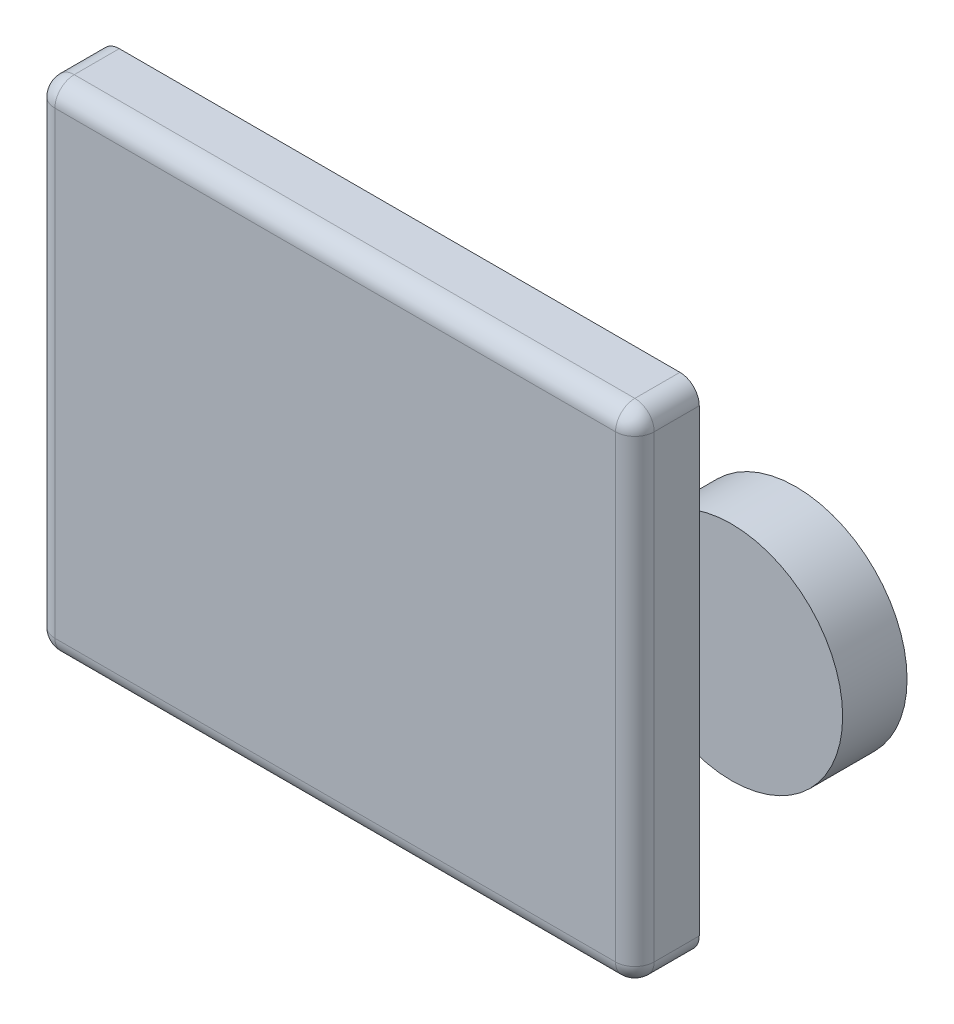
ISO-10303-21;
HEADER;
FILE_DESCRIPTION(('STEP AP214'),'2;1');
FILE_NAME('part.step','',(''),(''),'','','');
FILE_SCHEMA(('AUTOMOTIVE_DESIGN { 1 0 10303 214 1 1 1 1 }'));
ENDSEC;
DATA;
#1=APPLICATION_CONTEXT('core data for automotive mechanical design processes');
#2=APPLICATION_PROTOCOL_DEFINITION('international standard','automotive_design',2000,#1);
#3=PRODUCT_CONTEXT('',#1,'mechanical');
#4=PRODUCT('Part','Part','',(#3));
#5=PRODUCT_RELATED_PRODUCT_CATEGORY('part','',(#4));
#6=PRODUCT_DEFINITION_FORMATION('','',#4);
#7=PRODUCT_DEFINITION_CONTEXT('part definition',#1,'design');
#8=PRODUCT_DEFINITION('design','',#6,#7);
#9=PRODUCT_DEFINITION_SHAPE('','',#8);
#10=(LENGTH_UNIT() NAMED_UNIT(*) SI_UNIT(.MILLI.,.METRE.));
#11=(NAMED_UNIT(*) PLANE_ANGLE_UNIT() SI_UNIT($,.RADIAN.));
#12=(NAMED_UNIT(*) SI_UNIT($,.STERADIAN.) SOLID_ANGLE_UNIT());
#13=UNCERTAINTY_MEASURE_WITH_UNIT(LENGTH_MEASURE(1.E-05),#10,'distance_accuracy_value','');
#14=(GEOMETRIC_REPRESENTATION_CONTEXT(3) GLOBAL_UNCERTAINTY_ASSIGNED_CONTEXT((#13)) GLOBAL_UNIT_ASSIGNED_CONTEXT((#10,
#11,#12)) REPRESENTATION_CONTEXT('',''));
#15=CARTESIAN_POINT('',(0.,0.,0.));
#16=DIRECTION('',(0.,0.,1.));
#17=DIRECTION('',(1.,0.,0.));
#18=AXIS2_PLACEMENT_3D('',#15,#16,#17);
#19=CARTESIAN_POINT('',(44.0481916480239,-0.618220233656479,-15.));
#20=DIRECTION('',(0.,0.,1.));
#21=DIRECTION('',(1.,0.,0.));
#22=AXIS2_PLACEMENT_3D('',#19,#20,#21);
#23=CYLINDRICAL_SURFACE('',#22,17.2617733123611);
#24=CARTESIAN_POINT('',(44.0481916480239,-0.618220233656479,-15.));
#25=DIRECTION('',(0.,0.,1.));
#26=DIRECTION('',(1.,0.,0.));
#27=AXIS2_PLACEMENT_3D('',#24,#25,#26);
#28=CIRCLE('',#27,17.2617733123611);
#29=CARTESIAN_POINT('',(61.309964960385,-0.618220233656479,-15.));
#30=VERTEX_POINT('',#29);
#31=EDGE_CURVE('E11',#30,#30,#28,.T.);
#32=ORIENTED_EDGE('',*,*,#31,.T.);
#33=EDGE_LOOP('',(#32));
#34=FACE_BOUND('',#33,.T.);
#35=CARTESIAN_POINT('',(44.0481916480239,-0.618220233656479,-5.));
#36=DIRECTION('',(0.,0.,1.));
#37=DIRECTION('',(1.,0.,0.));
#38=AXIS2_PLACEMENT_3D('',#35,#36,#37);
#39=CIRCLE('',#38,17.2617733123611);
#40=CARTESIAN_POINT('',(61.309964960385,-0.618220233656479,-5.));
#41=VERTEX_POINT('',#40);
#42=EDGE_CURVE('E50',#41,#41,#39,.T.);
#43=ORIENTED_EDGE('',*,*,#42,.F.);
#44=EDGE_LOOP('',(#43));
#45=FACE_BOUND('',#44,.T.);
#46=ADVANCED_FACE('F47',(#34,#45),#23,.T.);
#47=CARTESIAN_POINT('',(44.0481916480239,-0.618220233656479,-15.));
#48=DIRECTION('',(0.,0.,1.));
#49=DIRECTION('',(1.,0.,0.));
#50=AXIS2_PLACEMENT_3D('',#47,#48,#49);
#51=PLANE('',#50);
#52=ORIENTED_EDGE('',*,*,#31,.F.);
#53=EDGE_LOOP('',(#52));
#54=FACE_BOUND('',#53,.T.);
#55=ADVANCED_FACE('F62',(#54),#51,.F.);
#56=CARTESIAN_POINT('',(44.0481916480239,-0.618220233656479,-5.));
#57=DIRECTION('',(0.,0.,1.));
#58=DIRECTION('',(1.,0.,0.));
#59=AXIS2_PLACEMENT_3D('',#56,#57,#58);
#60=PLANE('',#59);
#61=ORIENTED_EDGE('',*,*,#42,.T.);
#62=EDGE_LOOP('',(#61));
#63=FACE_BOUND('',#62,.T.);
#64=ADVANCED_FACE('F59',(#63),#60,.T.);
#65=CLOSED_SHELL('',(#46,#55,#64));
#66=MANIFOLD_SOLID_BREP('B2',#65);
#67=CARTESIAN_POINT('',(-48.9939535172757,38.0205443698732,10.));
#68=DIRECTION('',(1.,0.,0.));
#69=DIRECTION('',(0.,0.,-1.));
#70=AXIS2_PLACEMENT_3D('',#67,#68,#69);
#71=PLANE('',#70);
#72=DIRECTION('',(0.,-1.,0.));
#73=VECTOR('',#72,1.);
#74=CARTESIAN_POINT('',(-48.9939535172757,38.0205443698732,0.));
#75=LINE('',#74,#73);
#76=CARTESIAN_POINT('',(-48.9939535172757,35.0205443698732,0.));
#77=VERTEX_POINT('',#76);
#78=CARTESIAN_POINT('',(-48.9939535172757,-36.2569848371862,0.));
#79=VERTEX_POINT('',#78);
#80=EDGE_CURVE('E217',#77,#79,#75,.T.);
#81=ORIENTED_EDGE('',*,*,#80,.T.);
#82=DIRECTION('',(0.,0.,-1.));
#83=VECTOR('',#82,1.);
#84=CARTESIAN_POINT('',(-48.9939535172757,-36.2569848371862,10.));
#85=LINE('',#84,#83);
#86=CARTESIAN_POINT('',(-48.9939535172757,-36.2569848371862,7.));
#87=VERTEX_POINT('',#86);
#88=EDGE_CURVE('E241',#79,#87,#85,.F.);
#89=ORIENTED_EDGE('',*,*,#88,.T.);
#90=DIRECTION('',(0.,-1.,0.));
#91=VECTOR('',#90,1.);
#92=CARTESIAN_POINT('',(-48.9939535172757,38.0205443698732,7.));
#93=LINE('',#92,#91);
#94=CARTESIAN_POINT('',(-48.9939535172757,35.0205443698732,7.));
#95=VERTEX_POINT('',#94);
#96=EDGE_CURVE('E265',#87,#95,#93,.F.);
#97=ORIENTED_EDGE('',*,*,#96,.T.);
#98=DIRECTION('',(0.,0.,-1.));
#99=VECTOR('',#98,1.);
#100=CARTESIAN_POINT('',(-48.9939535172757,35.0205443698732,10.));
#101=LINE('',#100,#99);
#102=EDGE_CURVE('E239',#95,#77,#101,.T.);
#103=ORIENTED_EDGE('',*,*,#102,.T.);
#104=EDGE_LOOP('',(#81,#89,#97,#103));
#105=FACE_BOUND('',#104,.T.);
#106=ADVANCED_FACE('F88',(#105),#71,.F.);
#107=CARTESIAN_POINT('',(-48.9939535172757,-39.2569848371862,10.));
#108=DIRECTION('',(0.,1.,0.));
#109=DIRECTION('',(0.,0.,1.));
#110=AXIS2_PLACEMENT_3D('',#107,#108,#109);
#111=PLANE('',#110);
#112=DIRECTION('',(1.,0.,0.));
#113=VECTOR('',#112,1.);
#114=CARTESIAN_POINT('',(-48.9939535172757,-39.2569848371862,7.));
#115=LINE('',#114,#113);
#116=CARTESIAN_POINT('',(41.0481916480239,-39.2569848371862,7.));
#117=VERTEX_POINT('',#116);
#118=CARTESIAN_POINT('',(-45.9939535172757,-39.2569848371862,7.));
#119=VERTEX_POINT('',#118);
#120=EDGE_CURVE('E174',#117,#119,#115,.F.);
#121=ORIENTED_EDGE('',*,*,#120,.T.);
#122=DIRECTION('',(0.,0.,-1.));
#123=VECTOR('',#122,1.);
#124=CARTESIAN_POINT('',(-45.9939535172757,-39.2569848371862,10.));
#125=LINE('',#124,#123);
#126=CARTESIAN_POINT('',(-45.9939535172757,-39.2569848371862,0.));
#127=VERTEX_POINT('',#126);
#128=EDGE_CURVE('E232',#119,#127,#125,.T.);
#129=ORIENTED_EDGE('',*,*,#128,.T.);
#130=DIRECTION('',(1.,0.,0.));
#131=VECTOR('',#130,1.);
#132=CARTESIAN_POINT('',(-48.9939535172757,-39.2569848371862,0.));
#133=LINE('',#132,#131);
#134=CARTESIAN_POINT('',(41.0481916480239,-39.2569848371862,0.));
#135=VERTEX_POINT('',#134);
#136=EDGE_CURVE('E452',#127,#135,#133,.T.);
#137=ORIENTED_EDGE('',*,*,#136,.T.);
#138=DIRECTION('',(0.,0.,-1.));
#139=VECTOR('',#138,1.);
#140=CARTESIAN_POINT('',(41.0481916480239,-39.2569848371862,10.));
#141=LINE('',#140,#139);
#142=EDGE_CURVE('E213',#135,#117,#141,.F.);
#143=ORIENTED_EDGE('',*,*,#142,.T.);
#144=EDGE_LOOP('',(#121,#129,#137,#143));
#145=FACE_BOUND('',#144,.T.);
#146=ADVANCED_FACE('F273',(#145),#111,.F.);
#147=CARTESIAN_POINT('',(44.0481916480239,38.0205443698732,10.));
#148=DIRECTION('',(-1.,0.,0.));
#149=DIRECTION('',(0.,0.,1.));
#150=AXIS2_PLACEMENT_3D('',#147,#148,#149);
#151=PLANE('',#150);
#152=DIRECTION('',(0.,1.,0.));
#153=VECTOR('',#152,1.);
#154=CARTESIAN_POINT('',(44.0481916480239,38.0205443698732,0.));
#155=LINE('',#154,#153);
#156=CARTESIAN_POINT('',(44.0481916480239,-36.2569848371862,0.));
#157=VERTEX_POINT('',#156);
#158=CARTESIAN_POINT('',(44.0481916480239,35.0205443698732,0.));
#159=VERTEX_POINT('',#158);
#160=EDGE_CURVE('E450',#157,#159,#155,.T.);
#161=ORIENTED_EDGE('',*,*,#160,.T.);
#162=DIRECTION('',(0.,0.,-1.));
#163=VECTOR('',#162,1.);
#164=CARTESIAN_POINT('',(44.0481916480239,35.0205443698732,10.));
#165=LINE('',#164,#163);
#166=CARTESIAN_POINT('',(44.0481916480239,35.0205443698732,7.));
#167=VERTEX_POINT('',#166);
#168=EDGE_CURVE('E45',#159,#167,#165,.F.);
#169=ORIENTED_EDGE('',*,*,#168,.T.);
#170=DIRECTION('',(0.,1.,0.));
#171=VECTOR('',#170,1.);
#172=CARTESIAN_POINT('',(44.0481916480239,-39.2569848371862,7.));
#173=LINE('',#172,#171);
#174=CARTESIAN_POINT('',(44.0481916480239,-36.2569848371862,7.));
#175=VERTEX_POINT('',#174);
#176=EDGE_CURVE('E204',#167,#175,#173,.F.);
#177=ORIENTED_EDGE('',*,*,#176,.T.);
#178=DIRECTION('',(0.,0.,-1.));
#179=VECTOR('',#178,1.);
#180=CARTESIAN_POINT('',(44.0481916480239,-36.2569848371862,10.));
#181=LINE('',#180,#179);
#182=EDGE_CURVE('E179',#175,#157,#181,.T.);
#183=ORIENTED_EDGE('',*,*,#182,.T.);
#184=EDGE_LOOP('',(#161,#169,#177,#183));
#185=FACE_BOUND('',#184,.T.);
#186=ADVANCED_FACE('F306',(#185),#151,.F.);
#187=CARTESIAN_POINT('',(-48.9939535172757,38.0205443698732,10.));
#188=DIRECTION('',(0.,-1.,0.));
#189=DIRECTION('',(0.,0.,-1.));
#190=AXIS2_PLACEMENT_3D('',#187,#188,#189);
#191=PLANE('',#190);
#192=DIRECTION('',(-1.,0.,0.));
#193=VECTOR('',#192,1.);
#194=CARTESIAN_POINT('',(-48.9939535172757,38.0205443698732,0.));
#195=LINE('',#194,#193);
#196=CARTESIAN_POINT('',(41.0481916480239,38.0205443698732,0.));
#197=VERTEX_POINT('',#196);
#198=CARTESIAN_POINT('',(-45.9939535172757,38.0205443698732,0.));
#199=VERTEX_POINT('',#198);
#200=EDGE_CURVE('E199',#197,#199,#195,.T.);
#201=ORIENTED_EDGE('',*,*,#200,.T.);
#202=DIRECTION('',(0.,0.,-1.));
#203=VECTOR('',#202,1.);
#204=CARTESIAN_POINT('',(-45.9939535172757,38.0205443698732,10.));
#205=LINE('',#204,#203);
#206=CARTESIAN_POINT('',(-45.9939535172757,38.0205443698732,7.));
#207=VERTEX_POINT('',#206);
#208=EDGE_CURVE('E97',#199,#207,#205,.F.);
#209=ORIENTED_EDGE('',*,*,#208,.T.);
#210=DIRECTION('',(-1.,0.,0.));
#211=VECTOR('',#210,1.);
#212=CARTESIAN_POINT('',(44.0481916480239,38.0205443698732,7.));
#213=LINE('',#212,#211);
#214=CARTESIAN_POINT('',(41.0481916480239,38.0205443698732,7.));
#215=VERTEX_POINT('',#214);
#216=EDGE_CURVE('E261',#207,#215,#213,.F.);
#217=ORIENTED_EDGE('',*,*,#216,.T.);
#218=DIRECTION('',(0.,0.,-1.));
#219=VECTOR('',#218,1.);
#220=CARTESIAN_POINT('',(41.0481916480239,38.0205443698732,10.));
#221=LINE('',#220,#219);
#222=EDGE_CURVE('E112',#215,#197,#221,.T.);
#223=ORIENTED_EDGE('',*,*,#222,.T.);
#224=EDGE_LOOP('',(#201,#209,#217,#223));
#225=FACE_BOUND('',#224,.T.);
#226=ADVANCED_FACE('F263',(#225),#191,.F.);
#227=CARTESIAN_POINT('',(0.,0.,10.));
#228=DIRECTION('',(0.,0.,1.));
#229=DIRECTION('',(1.,0.,0.));
#230=AXIS2_PLACEMENT_3D('',#227,#228,#229);
#231=PLANE('',#230);
#232=DIRECTION('',(0.,1.,0.));
#233=VECTOR('',#232,1.);
#234=CARTESIAN_POINT('',(41.0481916480239,38.0205443698732,10.));
#235=LINE('',#234,#233);
#236=CARTESIAN_POINT('',(41.0481916480239,-36.2569848371862,10.));
#237=VERTEX_POINT('',#236);
#238=CARTESIAN_POINT('',(41.0481916480239,35.0205443698732,10.));
#239=VERTEX_POINT('',#238);
#240=EDGE_CURVE('E188',#237,#239,#235,.T.);
#241=ORIENTED_EDGE('',*,*,#240,.T.);
#242=DIRECTION('',(-1.,0.,0.));
#243=VECTOR('',#242,1.);
#244=CARTESIAN_POINT('',(-48.9939535172757,35.0205443698732,10.));
#245=LINE('',#244,#243);
#246=CARTESIAN_POINT('',(-45.9939535172757,35.0205443698732,10.));
#247=VERTEX_POINT('',#246);
#248=EDGE_CURVE('E262',#239,#247,#245,.T.);
#249=ORIENTED_EDGE('',*,*,#248,.T.);
#250=DIRECTION('',(0.,-1.,0.));
#251=VECTOR('',#250,1.);
#252=CARTESIAN_POINT('',(-45.9939535172757,-39.2569848371862,10.));
#253=LINE('',#252,#251);
#254=CARTESIAN_POINT('',(-45.9939535172757,-36.2569848371862,10.));
#255=VERTEX_POINT('',#254);
#256=EDGE_CURVE('E191',#247,#255,#253,.T.);
#257=ORIENTED_EDGE('',*,*,#256,.T.);
#258=DIRECTION('',(1.,0.,0.));
#259=VECTOR('',#258,1.);
#260=CARTESIAN_POINT('',(44.0481916480239,-36.2569848371862,10.));
#261=LINE('',#260,#259);
#262=EDGE_CURVE('E172',#255,#237,#261,.T.);
#263=ORIENTED_EDGE('',*,*,#262,.T.);
#264=EDGE_LOOP('',(#241,#249,#257,#263));
#265=FACE_BOUND('',#264,.T.);
#266=ADVANCED_FACE('F186',(#265),#231,.T.);
#267=CARTESIAN_POINT('',(0.,0.,0.));
#268=DIRECTION('',(0.,0.,1.));
#269=DIRECTION('',(1.,0.,0.));
#270=AXIS2_PLACEMENT_3D('',#267,#268,#269);
#271=PLANE('',#270);
#272=ORIENTED_EDGE('',*,*,#136,.F.);
#273=CARTESIAN_POINT('',(-45.9939535172757,-36.2569848371862,0.));
#274=DIRECTION('',(0.,0.,1.));
#275=DIRECTION('',(1.,0.,0.));
#276=AXIS2_PLACEMENT_3D('',#273,#274,#275);
#277=CIRCLE('',#276,3.);
#278=EDGE_CURVE('E237',#127,#79,#277,.F.);
#279=ORIENTED_EDGE('',*,*,#278,.T.);
#280=ORIENTED_EDGE('',*,*,#80,.F.);
#281=CARTESIAN_POINT('',(-45.9939535172757,35.0205443698732,0.));
#282=DIRECTION('',(0.,0.,1.));
#283=DIRECTION('',(1.,0.,0.));
#284=AXIS2_PLACEMENT_3D('',#281,#282,#283);
#285=CIRCLE('',#284,3.);
#286=EDGE_CURVE('E105',#77,#199,#285,.F.);
#287=ORIENTED_EDGE('',*,*,#286,.T.);
#288=ORIENTED_EDGE('',*,*,#200,.F.);
#289=CARTESIAN_POINT('',(41.0481916480239,35.0205443698732,0.));
#290=DIRECTION('',(0.,0.,1.));
#291=DIRECTION('',(1.,0.,0.));
#292=AXIS2_PLACEMENT_3D('',#289,#290,#291);
#293=CIRCLE('',#292,3.);
#294=EDGE_CURVE('E234',#197,#159,#293,.F.);
#295=ORIENTED_EDGE('',*,*,#294,.T.);
#296=ORIENTED_EDGE('',*,*,#160,.F.);
#297=CARTESIAN_POINT('',(41.0481916480239,-36.2569848371862,0.));
#298=DIRECTION('',(0.,0.,1.));
#299=DIRECTION('',(1.,0.,0.));
#300=AXIS2_PLACEMENT_3D('',#297,#298,#299);
#301=CIRCLE('',#300,3.);
#302=EDGE_CURVE('E210',#157,#135,#301,.F.);
#303=ORIENTED_EDGE('',*,*,#302,.T.);
#304=EDGE_LOOP('',(#272,#279,#280,#287,#288,#295,#296,#303));
#305=FACE_BOUND('',#304,.T.);
#306=ADVANCED_FACE('F319',(#305),#271,.F.);
#307=CARTESIAN_POINT('',(0.,-36.2569848371862,7.));
#308=DIRECTION('',(-1.,0.,0.));
#309=DIRECTION('',(0.,0.,1.));
#310=AXIS2_PLACEMENT_3D('',#307,#308,#309);
#311=CYLINDRICAL_SURFACE('',#310,3.);
#312=ORIENTED_EDGE('',*,*,#262,.F.);
#313=CARTESIAN_POINT('',(-45.9939535172757,-36.2569848371862,7.));
#314=DIRECTION('',(-1.,0.,0.));
#315=DIRECTION('',(0.,0.,1.));
#316=AXIS2_PLACEMENT_3D('',#313,#314,#315);
#317=CIRCLE('',#316,3.);
#318=EDGE_CURVE('E223',#255,#119,#317,.F.);
#319=ORIENTED_EDGE('',*,*,#318,.T.);
#320=ORIENTED_EDGE('',*,*,#120,.F.);
#321=CARTESIAN_POINT('',(41.0481916480239,-36.2569848371862,7.));
#322=DIRECTION('',(-1.,0.,0.));
#323=DIRECTION('',(0.,0.,1.));
#324=AXIS2_PLACEMENT_3D('',#321,#322,#323);
#325=CIRCLE('',#324,3.);
#326=EDGE_CURVE('E169',#117,#237,#325,.T.);
#327=ORIENTED_EDGE('',*,*,#326,.T.);
#328=EDGE_LOOP('',(#312,#319,#320,#327));
#329=FACE_BOUND('',#328,.T.);
#330=ADVANCED_FACE('F171',(#329),#311,.T.);
#331=CARTESIAN_POINT('',(41.0481916480239,0.,7.));
#332=DIRECTION('',(0.,-1.,0.));
#333=DIRECTION('',(0.,0.,-1.));
#334=AXIS2_PLACEMENT_3D('',#331,#332,#333);
#335=CYLINDRICAL_SURFACE('',#334,3.);
#336=ORIENTED_EDGE('',*,*,#176,.F.);
#337=CARTESIAN_POINT('',(41.0481916480239,35.0205443698732,7.));
#338=DIRECTION('',(0.,-1.,0.));
#339=DIRECTION('',(0.,0.,-1.));
#340=AXIS2_PLACEMENT_3D('',#337,#338,#339);
#341=CIRCLE('',#340,3.);
#342=EDGE_CURVE('E198',#167,#239,#341,.T.);
#343=ORIENTED_EDGE('',*,*,#342,.T.);
#344=ORIENTED_EDGE('',*,*,#240,.F.);
#345=CARTESIAN_POINT('',(41.0481916480239,-36.2569848371862,7.));
#346=DIRECTION('',(0.,-1.,0.));
#347=DIRECTION('',(0.,0.,-1.));
#348=AXIS2_PLACEMENT_3D('',#345,#346,#347);
#349=CIRCLE('',#348,3.);
#350=EDGE_CURVE('E180',#237,#175,#349,.F.);
#351=ORIENTED_EDGE('',*,*,#350,.T.);
#352=EDGE_LOOP('',(#336,#343,#344,#351));
#353=FACE_BOUND('',#352,.T.);
#354=ADVANCED_FACE('F196',(#353),#335,.T.);
#355=CARTESIAN_POINT('',(-45.9939535172757,0.,7.));
#356=DIRECTION('',(0.,1.,0.));
#357=DIRECTION('',(0.,0.,1.));
#358=AXIS2_PLACEMENT_3D('',#355,#356,#357);
#359=CYLINDRICAL_SURFACE('',#358,3.);
#360=ORIENTED_EDGE('',*,*,#96,.F.);
#361=CARTESIAN_POINT('',(-45.9939535172757,-36.2569848371862,7.));
#362=DIRECTION('',(0.,1.,0.));
#363=DIRECTION('',(0.,0.,1.));
#364=AXIS2_PLACEMENT_3D('',#361,#362,#363);
#365=CIRCLE('',#364,3.);
#366=EDGE_CURVE('E220',#87,#255,#365,.T.);
#367=ORIENTED_EDGE('',*,*,#366,.T.);
#368=ORIENTED_EDGE('',*,*,#256,.F.);
#369=CARTESIAN_POINT('',(-45.9939535172757,35.0205443698732,7.));
#370=DIRECTION('',(0.,1.,0.));
#371=DIRECTION('',(0.,0.,1.));
#372=AXIS2_PLACEMENT_3D('',#369,#370,#371);
#373=CIRCLE('',#372,3.);
#374=EDGE_CURVE('E215',#247,#95,#373,.F.);
#375=ORIENTED_EDGE('',*,*,#374,.T.);
#376=EDGE_LOOP('',(#360,#367,#368,#375));
#377=FACE_BOUND('',#376,.T.);
#378=ADVANCED_FACE('F286',(#377),#359,.T.);
#379=CARTESIAN_POINT('',(0.,35.0205443698732,7.));
#380=DIRECTION('',(1.,0.,0.));
#381=DIRECTION('',(0.,0.,-1.));
#382=AXIS2_PLACEMENT_3D('',#379,#380,#381);
#383=CYLINDRICAL_SURFACE('',#382,3.);
#384=ORIENTED_EDGE('',*,*,#216,.F.);
#385=CARTESIAN_POINT('',(-45.9939535172757,35.0205443698732,7.));
#386=DIRECTION('',(1.,0.,0.));
#387=DIRECTION('',(0.,0.,-1.));
#388=AXIS2_PLACEMENT_3D('',#385,#386,#387);
#389=CIRCLE('',#388,3.);
#390=EDGE_CURVE('E228',#207,#247,#389,.T.);
#391=ORIENTED_EDGE('',*,*,#390,.T.);
#392=ORIENTED_EDGE('',*,*,#248,.F.);
#393=CARTESIAN_POINT('',(41.0481916480239,35.0205443698732,7.));
#394=DIRECTION('',(1.,0.,0.));
#395=DIRECTION('',(0.,0.,-1.));
#396=AXIS2_PLACEMENT_3D('',#393,#394,#395);
#397=CIRCLE('',#396,3.);
#398=EDGE_CURVE('E225',#239,#215,#397,.F.);
#399=ORIENTED_EDGE('',*,*,#398,.T.);
#400=EDGE_LOOP('',(#384,#391,#392,#399));
#401=FACE_BOUND('',#400,.T.);
#402=ADVANCED_FACE('F260',(#401),#383,.T.);
#403=CARTESIAN_POINT('',(41.0481916480239,-36.2569848371862,10.));
#404=DIRECTION('',(0.,0.,-1.));
#405=DIRECTION('',(-1.,0.,0.));
#406=AXIS2_PLACEMENT_3D('',#403,#404,#405);
#407=CYLINDRICAL_SURFACE('',#406,3.);
#408=ORIENTED_EDGE('',*,*,#302,.F.);
#409=ORIENTED_EDGE('',*,*,#182,.F.);
#410=CARTESIAN_POINT('',(41.0481916480239,-36.2569848371862,7.));
#411=DIRECTION('',(0.,0.,1.));
#412=DIRECTION('',(1.,0.,0.));
#413=AXIS2_PLACEMENT_3D('',#410,#411,#412);
#414=CIRCLE('',#413,3.);
#415=EDGE_CURVE('E202',#117,#175,#414,.T.);
#416=ORIENTED_EDGE('',*,*,#415,.F.);
#417=ORIENTED_EDGE('',*,*,#142,.F.);
#418=EDGE_LOOP('',(#408,#409,#416,#417));
#419=FACE_BOUND('',#418,.T.);
#420=ADVANCED_FACE('F312',(#419),#407,.T.);
#421=CARTESIAN_POINT('',(41.0481916480239,-36.2569848371862,7.));
#422=DIRECTION('',(0.,0.,1.));
#423=DIRECTION('',(1.,0.,0.));
#424=AXIS2_PLACEMENT_3D('',#421,#422,#423);
#425=SPHERICAL_SURFACE('',#424,3.);
#426=ORIENTED_EDGE('',*,*,#350,.F.);
#427=ORIENTED_EDGE('',*,*,#326,.F.);
#428=ORIENTED_EDGE('',*,*,#415,.T.);
#429=EDGE_LOOP('',(#426,#427,#428));
#430=FACE_BOUND('',#429,.T.);
#431=ADVANCED_FACE('F201',(#430),#425,.T.);
#432=CARTESIAN_POINT('',(-45.9939535172757,-36.2569848371862,10.));
#433=DIRECTION('',(0.,0.,-1.));
#434=DIRECTION('',(-1.,0.,0.));
#435=AXIS2_PLACEMENT_3D('',#432,#433,#434);
#436=CYLINDRICAL_SURFACE('',#435,3.);
#437=ORIENTED_EDGE('',*,*,#278,.F.);
#438=ORIENTED_EDGE('',*,*,#128,.F.);
#439=CARTESIAN_POINT('',(-45.9939535172757,-36.2569848371862,7.));
#440=DIRECTION('',(0.,0.,1.));
#441=DIRECTION('',(1.,0.,0.));
#442=AXIS2_PLACEMENT_3D('',#439,#440,#441);
#443=CIRCLE('',#442,3.);
#444=EDGE_CURVE('E218',#87,#119,#443,.T.);
#445=ORIENTED_EDGE('',*,*,#444,.F.);
#446=ORIENTED_EDGE('',*,*,#88,.F.);
#447=EDGE_LOOP('',(#437,#438,#445,#446));
#448=FACE_BOUND('',#447,.T.);
#449=ADVANCED_FACE('F279',(#448),#436,.T.);
#450=CARTESIAN_POINT('',(-45.9939535172757,-36.2569848371862,7.));
#451=DIRECTION('',(0.,0.,1.));
#452=DIRECTION('',(1.,0.,0.));
#453=AXIS2_PLACEMENT_3D('',#450,#451,#452);
#454=SPHERICAL_SURFACE('',#453,3.);
#455=ORIENTED_EDGE('',*,*,#444,.T.);
#456=ORIENTED_EDGE('',*,*,#318,.F.);
#457=ORIENTED_EDGE('',*,*,#366,.F.);
#458=EDGE_LOOP('',(#455,#456,#457));
#459=FACE_BOUND('',#458,.T.);
#460=ADVANCED_FACE('F283',(#459),#454,.T.);
#461=CARTESIAN_POINT('',(-45.9939535172757,35.0205443698732,10.));
#462=DIRECTION('',(0.,0.,-1.));
#463=DIRECTION('',(-1.,0.,0.));
#464=AXIS2_PLACEMENT_3D('',#461,#462,#463);
#465=CYLINDRICAL_SURFACE('',#464,3.);
#466=ORIENTED_EDGE('',*,*,#286,.F.);
#467=ORIENTED_EDGE('',*,*,#102,.F.);
#468=CARTESIAN_POINT('',(-45.9939535172757,35.0205443698732,7.));
#469=DIRECTION('',(0.,0.,1.));
#470=DIRECTION('',(1.,0.,0.));
#471=AXIS2_PLACEMENT_3D('',#468,#469,#470);
#472=CIRCLE('',#471,3.);
#473=EDGE_CURVE('E246',#207,#95,#472,.T.);
#474=ORIENTED_EDGE('',*,*,#473,.F.);
#475=ORIENTED_EDGE('',*,*,#208,.F.);
#476=EDGE_LOOP('',(#466,#467,#474,#475));
#477=FACE_BOUND('',#476,.T.);
#478=ADVANCED_FACE('F291',(#477),#465,.T.);
#479=CARTESIAN_POINT('',(-45.9939535172757,35.0205443698732,7.));
#480=DIRECTION('',(0.,0.,1.));
#481=DIRECTION('',(1.,0.,0.));
#482=AXIS2_PLACEMENT_3D('',#479,#480,#481);
#483=SPHERICAL_SURFACE('',#482,3.);
#484=ORIENTED_EDGE('',*,*,#473,.T.);
#485=ORIENTED_EDGE('',*,*,#374,.F.);
#486=ORIENTED_EDGE('',*,*,#390,.F.);
#487=EDGE_LOOP('',(#484,#485,#486));
#488=FACE_BOUND('',#487,.T.);
#489=ADVANCED_FACE('F292',(#488),#483,.T.);
#490=CARTESIAN_POINT('',(41.0481916480239,35.0205443698732,10.));
#491=DIRECTION('',(0.,0.,-1.));
#492=DIRECTION('',(-1.,0.,0.));
#493=AXIS2_PLACEMENT_3D('',#490,#491,#492);
#494=CYLINDRICAL_SURFACE('',#493,3.);
#495=ORIENTED_EDGE('',*,*,#294,.F.);
#496=ORIENTED_EDGE('',*,*,#222,.F.);
#497=CARTESIAN_POINT('',(41.0481916480239,35.0205443698732,7.));
#498=DIRECTION('',(0.,0.,1.));
#499=DIRECTION('',(1.,0.,0.));
#500=AXIS2_PLACEMENT_3D('',#497,#498,#499);
#501=CIRCLE('',#500,3.);
#502=EDGE_CURVE('E92',#167,#215,#501,.T.);
#503=ORIENTED_EDGE('',*,*,#502,.F.);
#504=ORIENTED_EDGE('',*,*,#168,.F.);
#505=EDGE_LOOP('',(#495,#496,#503,#504));
#506=FACE_BOUND('',#505,.T.);
#507=ADVANCED_FACE('F90',(#506),#494,.T.);
#508=CARTESIAN_POINT('',(41.0481916480239,35.0205443698732,7.));
#509=DIRECTION('',(0.,0.,1.));
#510=DIRECTION('',(1.,0.,0.));
#511=AXIS2_PLACEMENT_3D('',#508,#509,#510);
#512=SPHERICAL_SURFACE('',#511,3.);
#513=ORIENTED_EDGE('',*,*,#398,.F.);
#514=ORIENTED_EDGE('',*,*,#342,.F.);
#515=ORIENTED_EDGE('',*,*,#502,.T.);
#516=EDGE_LOOP('',(#513,#514,#515));
#517=FACE_BOUND('',#516,.T.);
#518=ADVANCED_FACE('F254',(#517),#512,.T.);
#519=CLOSED_SHELL('',(#106,#146,#186,#226,#266,#306,#330,#354,#378,#402,#420,#431,#449,#460,
#478,#489,#507,#518));
#520=MANIFOLD_SOLID_BREP('B6',#519);
#521=ADVANCED_BREP_SHAPE_REPRESENTATION('',(#18,#66,#520),#14);
#522=SHAPE_DEFINITION_REPRESENTATION(#9,#521);
ENDSEC;
END-ISO-10303-21;
